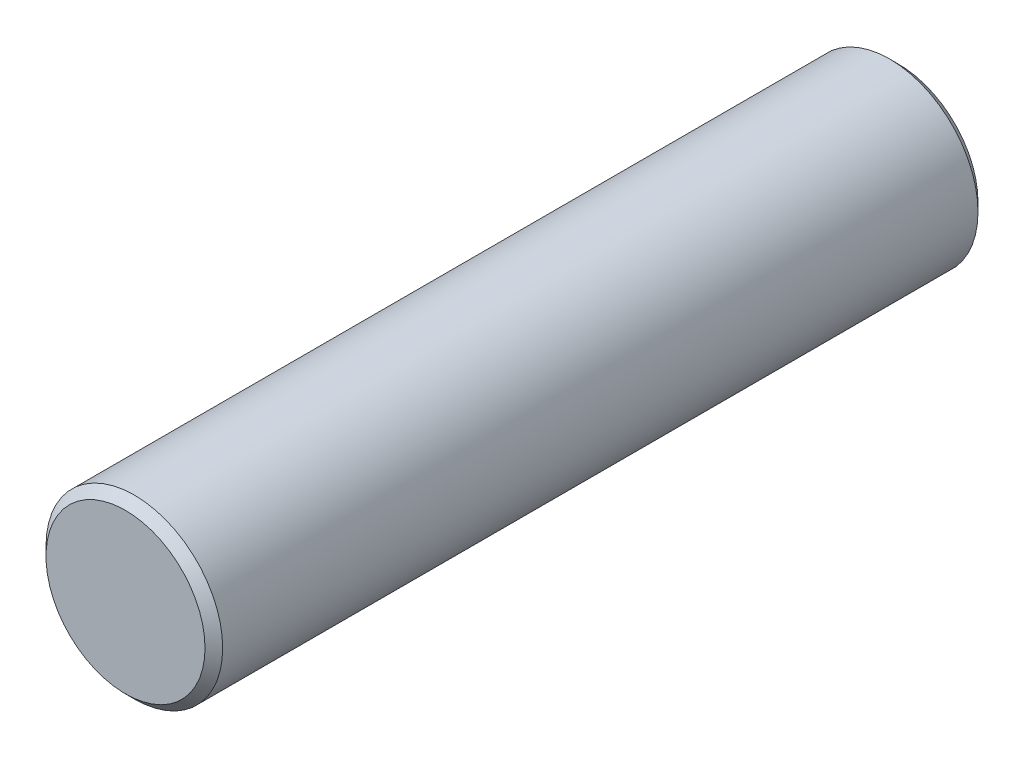
ISO-10303-21;
HEADER;
FILE_DESCRIPTION(('STEP AP214'),'2;1');
FILE_NAME('part.step','',(''),(''),'','','');
FILE_SCHEMA(('AUTOMOTIVE_DESIGN { 1 0 10303 214 1 1 1 1 }'));
ENDSEC;
DATA;
#1=APPLICATION_CONTEXT('core data for automotive mechanical design processes');
#2=APPLICATION_PROTOCOL_DEFINITION('international standard','automotive_design',2000,#1);
#3=PRODUCT_CONTEXT('',#1,'mechanical');
#4=PRODUCT('Part','Part','',(#3));
#5=PRODUCT_RELATED_PRODUCT_CATEGORY('part','',(#4));
#6=PRODUCT_DEFINITION_FORMATION('','',#4);
#7=PRODUCT_DEFINITION_CONTEXT('part definition',#1,'design');
#8=PRODUCT_DEFINITION('design','',#6,#7);
#9=PRODUCT_DEFINITION_SHAPE('','',#8);
#10=(LENGTH_UNIT() NAMED_UNIT(*) SI_UNIT(.MILLI.,.METRE.));
#11=(NAMED_UNIT(*) PLANE_ANGLE_UNIT() SI_UNIT($,.RADIAN.));
#12=(NAMED_UNIT(*) SI_UNIT($,.STERADIAN.) SOLID_ANGLE_UNIT());
#13=UNCERTAINTY_MEASURE_WITH_UNIT(LENGTH_MEASURE(1.E-05),#10,'distance_accuracy_value','');
#14=(GEOMETRIC_REPRESENTATION_CONTEXT(3) GLOBAL_UNCERTAINTY_ASSIGNED_CONTEXT((#13)) GLOBAL_UNIT_ASSIGNED_CONTEXT((#10,
#11,#12)) REPRESENTATION_CONTEXT('',''));
#15=CARTESIAN_POINT('',(0.,0.,0.));
#16=DIRECTION('',(0.,0.,1.));
#17=DIRECTION('',(1.,0.,0.));
#18=AXIS2_PLACEMENT_3D('',#15,#16,#17);
#19=CARTESIAN_POINT('',(0.,0.,175.));
#20=DIRECTION('',(0.,0.,-1.));
#21=DIRECTION('',(-1.,0.,0.));
#22=AXIS2_PLACEMENT_3D('',#19,#20,#21);
#23=CYLINDRICAL_SURFACE('',#22,20.);
#24=CARTESIAN_POINT('',(0.,0.,2.));
#25=DIRECTION('',(0.,0.,1.));
#26=DIRECTION('',(1.,0.,0.));
#27=AXIS2_PLACEMENT_3D('',#24,#25,#26);
#28=CIRCLE('',#27,20.);
#29=CARTESIAN_POINT('',(20.,0.,2.));
#30=VERTEX_POINT('',#29);
#31=EDGE_CURVE('E333',#30,#30,#28,.T.);
#32=ORIENTED_EDGE('',*,*,#31,.T.);
#33=EDGE_LOOP('',(#32));
#34=FACE_BOUND('',#33,.T.);
#35=CARTESIAN_POINT('',(0.,0.,173.));
#36=DIRECTION('',(0.,0.,1.));
#37=DIRECTION('',(1.,0.,0.));
#38=AXIS2_PLACEMENT_3D('',#35,#36,#37);
#39=CIRCLE('',#38,20.);
#40=CARTESIAN_POINT('',(20.,0.,173.));
#41=VERTEX_POINT('',#40);
#42=EDGE_CURVE('E337',#41,#41,#39,.F.);
#43=ORIENTED_EDGE('',*,*,#42,.T.);
#44=EDGE_LOOP('',(#43));
#45=FACE_BOUND('',#44,.T.);
#46=ADVANCED_FACE('F322',(#34,#45),#23,.T.);
#47=CARTESIAN_POINT('',(0.,0.,175.));
#48=DIRECTION('',(0.,0.,1.));
#49=DIRECTION('',(1.,0.,0.));
#50=AXIS2_PLACEMENT_3D('',#47,#48,#49);
#51=PLANE('',#50);
#52=CARTESIAN_POINT('',(0.,0.,175.));
#53=DIRECTION('',(0.,0.,1.));
#54=DIRECTION('',(1.,0.,0.));
#55=AXIS2_PLACEMENT_3D('',#52,#53,#54);
#56=CIRCLE('',#55,18.);
#57=CARTESIAN_POINT('',(18.,0.,175.));
#58=VERTEX_POINT('',#57);
#59=EDGE_CURVE('E13',#58,#58,#56,.T.);
#60=ORIENTED_EDGE('',*,*,#59,.T.);
#61=EDGE_LOOP('',(#60));
#62=FACE_BOUND('',#61,.T.);
#63=ADVANCED_FACE('F353',(#62),#51,.T.);
#64=CARTESIAN_POINT('',(0.,0.,0.));
#65=DIRECTION('',(0.,0.,1.));
#66=DIRECTION('',(1.,0.,0.));
#67=AXIS2_PLACEMENT_3D('',#64,#65,#66);
#68=PLANE('',#67);
#69=CARTESIAN_POINT('',(0.,0.,0.));
#70=DIRECTION('',(0.,0.,1.));
#71=DIRECTION('',(1.,0.,0.));
#72=AXIS2_PLACEMENT_3D('',#69,#70,#71);
#73=CIRCLE('',#72,18.);
#74=CARTESIAN_POINT('',(18.,0.,0.));
#75=VERTEX_POINT('',#74);
#76=EDGE_CURVE('E329',#75,#75,#73,.F.);
#77=ORIENTED_EDGE('',*,*,#76,.T.);
#78=EDGE_LOOP('',(#77));
#79=FACE_BOUND('',#78,.T.);
#80=ADVANCED_FACE('F350',(#79),#68,.F.);
#81=CARTESIAN_POINT('',(0.,0.,2.));
#82=DIRECTION('',(0.,0.,1.));
#83=DIRECTION('',(1.,0.,0.));
#84=AXIS2_PLACEMENT_3D('',#81,#82,#83);
#85=CONICAL_SURFACE('',#84,20.,0.785398163397451);
#86=ORIENTED_EDGE('',*,*,#76,.F.);
#87=EDGE_LOOP('',(#86));
#88=FACE_BOUND('',#87,.T.);
#89=ORIENTED_EDGE('',*,*,#31,.F.);
#90=EDGE_LOOP('',(#89));
#91=FACE_BOUND('',#90,.T.);
#92=ADVANCED_FACE('F346',(#88,#91),#85,.T.);
#93=CARTESIAN_POINT('',(0.,0.,175.));
#94=DIRECTION('',(0.,0.,-1.));
#95=DIRECTION('',(-1.,0.,0.));
#96=AXIS2_PLACEMENT_3D('',#93,#94,#95);
#97=CONICAL_SURFACE('',#96,18.,0.785398163397451);
#98=ORIENTED_EDGE('',*,*,#42,.F.);
#99=EDGE_LOOP('',(#98));
#100=FACE_BOUND('',#99,.T.);
#101=ORIENTED_EDGE('',*,*,#59,.F.);
#102=EDGE_LOOP('',(#101));
#103=FACE_BOUND('',#102,.T.);
#104=ADVANCED_FACE('F324',(#100,#103),#97,.T.);
#105=CLOSED_SHELL('',(#46,#63,#80,#92,#104));
#106=MANIFOLD_SOLID_BREP('B2',#105);
#107=ADVANCED_BREP_SHAPE_REPRESENTATION('',(#18,#106),#14);
#108=SHAPE_DEFINITION_REPRESENTATION(#9,#107);
ENDSEC;
END-ISO-10303-21;
